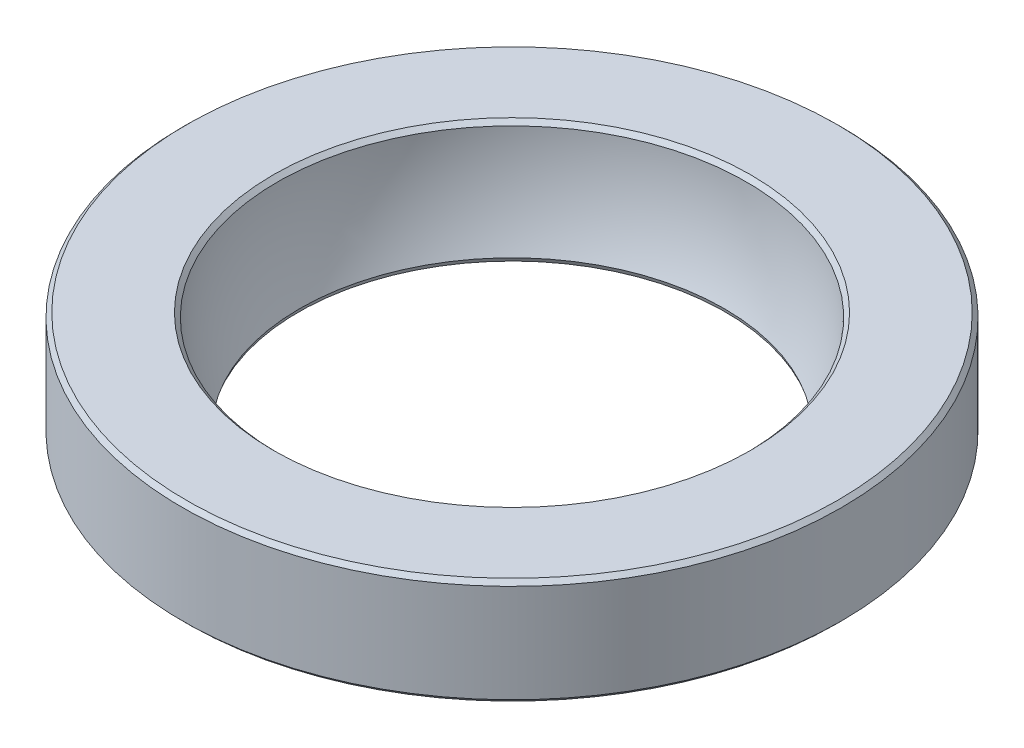
ISO-10303-21;
HEADER;
FILE_DESCRIPTION(('STEP AP214'),'2;1');
FILE_NAME('part.step','',(''),(''),'','','');
FILE_SCHEMA(('AUTOMOTIVE_DESIGN { 1 0 10303 214 1 1 1 1 }'));
ENDSEC;
DATA;
#1=APPLICATION_CONTEXT('core data for automotive mechanical design processes');
#2=APPLICATION_PROTOCOL_DEFINITION('international standard','automotive_design',2000,#1);
#3=PRODUCT_CONTEXT('',#1,'mechanical');
#4=PRODUCT('Part','Part','',(#3));
#5=PRODUCT_RELATED_PRODUCT_CATEGORY('part','',(#4));
#6=PRODUCT_DEFINITION_FORMATION('','',#4);
#7=PRODUCT_DEFINITION_CONTEXT('part definition',#1,'design');
#8=PRODUCT_DEFINITION('design','',#6,#7);
#9=PRODUCT_DEFINITION_SHAPE('','',#8);
#10=(LENGTH_UNIT() NAMED_UNIT(*) SI_UNIT(.MILLI.,.METRE.));
#11=(NAMED_UNIT(*) PLANE_ANGLE_UNIT() SI_UNIT($,.RADIAN.));
#12=(NAMED_UNIT(*) SI_UNIT($,.STERADIAN.) SOLID_ANGLE_UNIT());
#13=UNCERTAINTY_MEASURE_WITH_UNIT(LENGTH_MEASURE(1.E-05),#10,'distance_accuracy_value','');
#14=(GEOMETRIC_REPRESENTATION_CONTEXT(3) GLOBAL_UNCERTAINTY_ASSIGNED_CONTEXT((#13)) GLOBAL_UNIT_ASSIGNED_CONTEXT((#10,
#11,#12)) REPRESENTATION_CONTEXT('',''));
#15=CARTESIAN_POINT('',(0.,0.,0.));
#16=DIRECTION('',(0.,0.,1.));
#17=DIRECTION('',(1.,0.,0.));
#18=AXIS2_PLACEMENT_3D('',#15,#16,#17);
#19=CARTESIAN_POINT('',(0.,6.,0.));
#20=DIRECTION('',(0.,1.,0.));
#21=DIRECTION('',(-1.,0.,0.));
#22=AXIS2_PLACEMENT_3D('',#19,#20,#21);
#23=CYLINDRICAL_SURFACE('',#22,12.);
#24=CARTESIAN_POINT('',(0.,-3.725,0.));
#25=DIRECTION('',(0.,-1.,0.));
#26=DIRECTION('',(1.,0.,0.));
#27=AXIS2_PLACEMENT_3D('',#24,#25,#26);
#28=CIRCLE('',#27,12.);
#29=CARTESIAN_POINT('',(12.,-3.725,0.));
#30=VERTEX_POINT('',#29);
#31=EDGE_CURVE('E60',#30,#30,#28,.F.);
#32=ORIENTED_EDGE('',*,*,#31,.T.);
#33=EDGE_LOOP('',(#32));
#34=FACE_BOUND('',#33,.T.);
#35=CARTESIAN_POINT('',(0.,-0.149999999999996,0.));
#36=DIRECTION('',(0.,-1.,0.));
#37=DIRECTION('',(1.,0.,0.));
#38=AXIS2_PLACEMENT_3D('',#35,#36,#37);
#39=CIRCLE('',#38,12.);
#40=CARTESIAN_POINT('',(12.,-0.149999999999992,0.));
#41=VERTEX_POINT('',#40);
#42=EDGE_CURVE('E63',#41,#41,#39,.T.);
#43=ORIENTED_EDGE('',*,*,#42,.T.);
#44=EDGE_LOOP('',(#43));
#45=FACE_BOUND('',#44,.T.);
#46=ADVANCED_FACE('F33',(#34,#45),#23,.T.);
#47=CARTESIAN_POINT('',(0.,0.,0.));
#48=DIRECTION('',(0.,1.,0.));
#49=DIRECTION('',(-1.,0.,0.));
#50=AXIS2_PLACEMENT_3D('',#47,#48,#49);
#51=DEGENERATE_TOROIDAL_SURFACE('',#50,0.458203932499365,9.,.F.);
#52=CARTESIAN_POINT('',(0.,-3.73792050132501,0.));
#53=DIRECTION('',(0.,1.,0.));
#54=DIRECTION('',(-1.,0.,0.));
#55=AXIS2_PLACEMENT_3D('',#52,#53,#54);
#56=CIRCLE('',#55,7.72885599923279);
#57=CARTESIAN_POINT('',(-7.72885599923279,-3.73792050132501,0.));
#58=VERTEX_POINT('',#57);
#59=EDGE_CURVE('E45',#58,#58,#56,.F.);
#60=ORIENTED_EDGE('',*,*,#59,.T.);
#61=EDGE_LOOP('',(#60));
#62=FACE_BOUND('',#61,.T.);
#63=CARTESIAN_POINT('',(0.,-0.151271369082408,0.));
#64=DIRECTION('',(0.,1.,0.));
#65=DIRECTION('',(0.,0.,1.));
#66=AXIS2_PLACEMENT_3D('',#63,#64,#65);
#67=CIRCLE('',#66,8.54052469841822);
#68=CARTESIAN_POINT('',(0.,-0.151271369082408,8.54052469841822));
#69=VERTEX_POINT('',#68);
#70=EDGE_CURVE('E49',#69,#69,#67,.T.);
#71=ORIENTED_EDGE('',*,*,#70,.T.);
#72=EDGE_LOOP('',(#71));
#73=FACE_BOUND('',#72,.T.);
#74=ADVANCED_FACE('F82',(#62,#73),#51,.T.);
#75=CARTESIAN_POINT('',(-7.66487276294061,-3.875,0.));
#76=DIRECTION('',(0.,-1.,0.));
#77=DIRECTION('',(1.,0.,0.));
#78=AXIS2_PLACEMENT_3D('',#75,#76,#77);
#79=PLANE('',#78);
#80=CARTESIAN_POINT('',(0.,-3.875,0.));
#81=DIRECTION('',(0.,-1.,0.));
#82=DIRECTION('',(1.,0.,0.));
#83=AXIS2_PLACEMENT_3D('',#80,#81,#82);
#84=CIRCLE('',#83,11.85);
#85=CARTESIAN_POINT('',(11.85,-3.87499999999999,0.));
#86=VERTEX_POINT('',#85);
#87=EDGE_CURVE('E54',#86,#86,#84,.T.);
#88=ORIENTED_EDGE('',*,*,#87,.T.);
#89=EDGE_LOOP('',(#88));
#90=FACE_BOUND('',#89,.T.);
#91=CARTESIAN_POINT('',(0.,-3.875,0.));
#92=DIRECTION('',(0.,-1.,0.));
#93=DIRECTION('',(1.,0.,0.));
#94=AXIS2_PLACEMENT_3D('',#91,#92,#93);
#95=CIRCLE('',#94,7.77739079681124);
#96=CARTESIAN_POINT('',(7.77739079681124,-3.87499999999999,0.));
#97=VERTEX_POINT('',#96);
#98=EDGE_CURVE('E57',#97,#97,#95,.F.);
#99=ORIENTED_EDGE('',*,*,#98,.T.);
#100=EDGE_LOOP('',(#99));
#101=FACE_BOUND('',#100,.T.);
#102=ADVANCED_FACE('F88',(#90,#101),#79,.T.);
#103=CARTESIAN_POINT('',(-12.,0.,-12.));
#104=DIRECTION('',(0.,-1.,0.));
#105=DIRECTION('',(0.,0.,-1.));
#106=AXIS2_PLACEMENT_3D('',#103,#104,#105);
#107=PLANE('',#106);
#108=CARTESIAN_POINT('',(0.,0.,0.));
#109=DIRECTION('',(0.,-1.,0.));
#110=DIRECTION('',(0.,0.,-1.));
#111=AXIS2_PLACEMENT_3D('',#108,#109,#110);
#112=CIRCLE('',#111,11.85);
#113=CARTESIAN_POINT('',(0.,0.,-11.85));
#114=VERTEX_POINT('',#113);
#115=EDGE_CURVE('E10',#114,#114,#112,.F.);
#116=ORIENTED_EDGE('',*,*,#115,.T.);
#117=EDGE_LOOP('',(#116));
#118=FACE_BOUND('',#117,.T.);
#119=CARTESIAN_POINT('',(0.,0.,0.));
#120=DIRECTION('',(0.,-1.,0.));
#121=DIRECTION('',(0.,0.,-1.));
#122=AXIS2_PLACEMENT_3D('',#119,#120,#121);
#123=CIRCLE('',#122,8.69179606750063);
#124=CARTESIAN_POINT('',(0.,0.,-8.69179606750063));
#125=VERTEX_POINT('',#124);
#126=EDGE_CURVE('E41',#125,#125,#123,.T.);
#127=ORIENTED_EDGE('',*,*,#126,.T.);
#128=EDGE_LOOP('',(#127));
#129=FACE_BOUND('',#128,.T.);
#130=ADVANCED_FACE('F99',(#118,#129),#107,.F.);
#131=CARTESIAN_POINT('',(0.,-3.725,0.));
#132=DIRECTION('',(0.,1.,0.));
#133=DIRECTION('',(-1.,0.,0.));
#134=AXIS2_PLACEMENT_3D('',#131,#132,#133);
#135=CONICAL_SURFACE('',#134,12.,0.785398163397454);
#136=ORIENTED_EDGE('',*,*,#87,.F.);
#137=EDGE_LOOP('',(#136));
#138=FACE_BOUND('',#137,.T.);
#139=ORIENTED_EDGE('',*,*,#31,.F.);
#140=EDGE_LOOP('',(#139));
#141=FACE_BOUND('',#140,.T.);
#142=ADVANCED_FACE('F77',(#138,#141),#135,.T.);
#143=CARTESIAN_POINT('',(0.,-3.875,0.));
#144=DIRECTION('',(0.,-1.,0.));
#145=DIRECTION('',(1.,0.,0.));
#146=AXIS2_PLACEMENT_3D('',#143,#144,#145);
#147=CONICAL_SURFACE('',#146,7.77739079681124,0.340289946445098);
#148=ORIENTED_EDGE('',*,*,#59,.F.);
#149=EDGE_LOOP('',(#148));
#150=FACE_BOUND('',#149,.T.);
#151=ORIENTED_EDGE('',*,*,#98,.F.);
#152=EDGE_LOOP('',(#151));
#153=FACE_BOUND('',#152,.T.);
#154=ADVANCED_FACE('F71',(#150,#153),#147,.F.);
#155=CARTESIAN_POINT('',(0.,0.,0.));
#156=DIRECTION('',(0.,-1.,0.));
#157=DIRECTION('',(1.,0.,0.));
#158=AXIS2_PLACEMENT_3D('',#155,#156,#157);
#159=CONICAL_SURFACE('',#158,11.85,0.785398163397448);
#160=ORIENTED_EDGE('',*,*,#42,.F.);
#161=EDGE_LOOP('',(#160));
#162=FACE_BOUND('',#161,.T.);
#163=ORIENTED_EDGE('',*,*,#115,.F.);
#164=EDGE_LOOP('',(#163));
#165=FACE_BOUND('',#164,.T.);
#166=ADVANCED_FACE('F68',(#162,#165),#159,.T.);
#167=CARTESIAN_POINT('',(0.,0.,0.));
#168=DIRECTION('',(0.,1.,0.));
#169=DIRECTION('',(0.,0.,1.));
#170=AXIS2_PLACEMENT_3D('',#167,#168,#169);
#171=CONICAL_SURFACE('',#170,8.69179606750063,0.78539816339744);
#172=ORIENTED_EDGE('',*,*,#70,.F.);
#173=EDGE_LOOP('',(#172));
#174=FACE_BOUND('',#173,.T.);
#175=ORIENTED_EDGE('',*,*,#126,.F.);
#176=EDGE_LOOP('',(#175));
#177=FACE_BOUND('',#176,.T.);
#178=ADVANCED_FACE('F36',(#174,#177),#171,.F.);
#179=CLOSED_SHELL('',(#46,#74,#102,#130,#142,#154,#166,#178));
#180=MANIFOLD_SOLID_BREP('B2',#179);
#181=ADVANCED_BREP_SHAPE_REPRESENTATION('',(#18,#180),#14);
#182=SHAPE_DEFINITION_REPRESENTATION(#9,#181);
ENDSEC;
END-ISO-10303-21;
